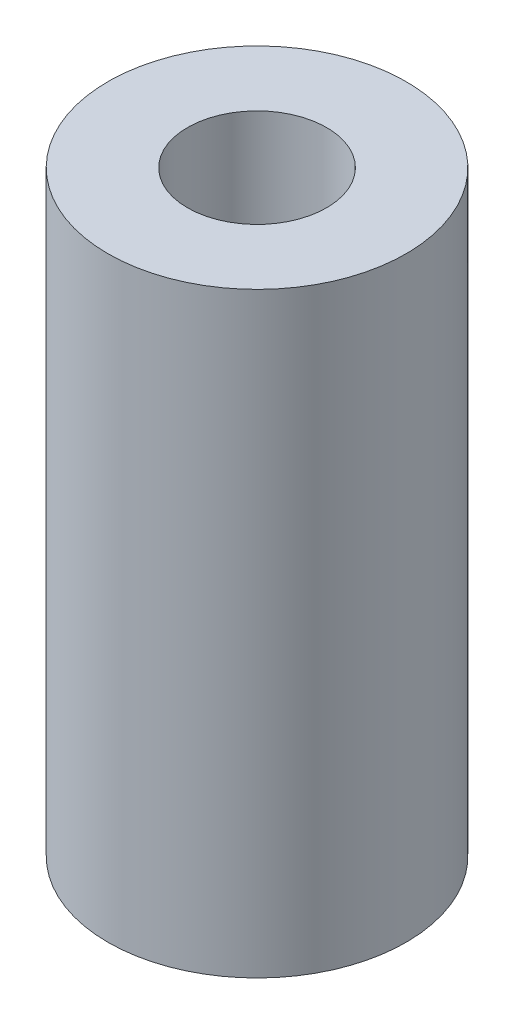
ISO-10303-21;
HEADER;
FILE_DESCRIPTION(('STEP AP214'),'2;1');
FILE_NAME('part.step','',(''),(''),'','','');
FILE_SCHEMA(('AUTOMOTIVE_DESIGN { 1 0 10303 214 1 1 1 1 }'));
ENDSEC;
DATA;
#1=APPLICATION_CONTEXT('core data for automotive mechanical design processes');
#2=APPLICATION_PROTOCOL_DEFINITION('international standard','automotive_design',2000,#1);
#3=PRODUCT_CONTEXT('',#1,'mechanical');
#4=PRODUCT('Part','Part','',(#3));
#5=PRODUCT_RELATED_PRODUCT_CATEGORY('part','',(#4));
#6=PRODUCT_DEFINITION_FORMATION('','',#4);
#7=PRODUCT_DEFINITION_CONTEXT('part definition',#1,'design');
#8=PRODUCT_DEFINITION('design','',#6,#7);
#9=PRODUCT_DEFINITION_SHAPE('','',#8);
#10=(LENGTH_UNIT() NAMED_UNIT(*) SI_UNIT(.MILLI.,.METRE.));
#11=(NAMED_UNIT(*) PLANE_ANGLE_UNIT() SI_UNIT($,.RADIAN.));
#12=(NAMED_UNIT(*) SI_UNIT($,.STERADIAN.) SOLID_ANGLE_UNIT());
#13=UNCERTAINTY_MEASURE_WITH_UNIT(LENGTH_MEASURE(1.E-05),#10,'distance_accuracy_value','');
#14=(GEOMETRIC_REPRESENTATION_CONTEXT(3) GLOBAL_UNCERTAINTY_ASSIGNED_CONTEXT((#13)) GLOBAL_UNIT_ASSIGNED_CONTEXT((#10,
#11,#12)) REPRESENTATION_CONTEXT('',''));
#15=CARTESIAN_POINT('',(0.,0.,0.));
#16=DIRECTION('',(0.,0.,1.));
#17=DIRECTION('',(1.,0.,0.));
#18=AXIS2_PLACEMENT_3D('',#15,#16,#17);
#19=CARTESIAN_POINT('',(0.,12.,0.));
#20=DIRECTION('',(0.,1.,0.));
#21=DIRECTION('',(0.,0.,1.));
#22=AXIS2_PLACEMENT_3D('',#19,#20,#21);
#23=PLANE('',#22);
#24=CARTESIAN_POINT('',(0.,12.,0.));
#25=DIRECTION('',(0.,1.,0.));
#26=DIRECTION('',(0.,0.,1.));
#27=AXIS2_PLACEMENT_3D('',#24,#25,#26);
#28=CIRCLE('',#27,3.);
#29=CARTESIAN_POINT('',(0.,12.,3.));
#30=VERTEX_POINT('',#29);
#31=EDGE_CURVE('E10',#30,#30,#28,.T.);
#32=ORIENTED_EDGE('',*,*,#31,.T.);
#33=EDGE_LOOP('',(#32));
#34=FACE_BOUND('',#33,.T.);
#35=CARTESIAN_POINT('',(0.,12.,0.));
#36=DIRECTION('',(0.,1.,0.));
#37=DIRECTION('',(0.,0.,1.));
#38=AXIS2_PLACEMENT_3D('',#35,#36,#37);
#39=CIRCLE('',#38,1.4);
#40=CARTESIAN_POINT('',(0.,12.,1.4));
#41=VERTEX_POINT('',#40);
#42=EDGE_CURVE('E42',#41,#41,#39,.T.);
#43=ORIENTED_EDGE('',*,*,#42,.F.);
#44=EDGE_LOOP('',(#43));
#45=FACE_BOUND('',#44,.T.);
#46=ADVANCED_FACE('F31',(#34,#45),#23,.T.);
#47=CARTESIAN_POINT('',(0.,0.,0.));
#48=DIRECTION('',(0.,1.,0.));
#49=DIRECTION('',(0.,0.,1.));
#50=AXIS2_PLACEMENT_3D('',#47,#48,#49);
#51=PLANE('',#50);
#52=CARTESIAN_POINT('',(0.,0.,0.));
#53=DIRECTION('',(0.,1.,0.));
#54=DIRECTION('',(0.,0.,1.));
#55=AXIS2_PLACEMENT_3D('',#52,#53,#54);
#56=CIRCLE('',#55,3.);
#57=CARTESIAN_POINT('',(0.,0.,3.));
#58=VERTEX_POINT('',#57);
#59=EDGE_CURVE('E35',#58,#58,#56,.T.);
#60=ORIENTED_EDGE('',*,*,#59,.F.);
#61=EDGE_LOOP('',(#60));
#62=FACE_BOUND('',#61,.T.);
#63=CARTESIAN_POINT('',(0.,0.,0.));
#64=DIRECTION('',(0.,1.,0.));
#65=DIRECTION('',(0.,0.,1.));
#66=AXIS2_PLACEMENT_3D('',#63,#64,#65);
#67=CIRCLE('',#66,1.4);
#68=CARTESIAN_POINT('',(0.,0.,1.4));
#69=VERTEX_POINT('',#68);
#70=EDGE_CURVE('E44',#69,#69,#67,.T.);
#71=ORIENTED_EDGE('',*,*,#70,.T.);
#72=EDGE_LOOP('',(#71));
#73=FACE_BOUND('',#72,.T.);
#74=ADVANCED_FACE('F54',(#62,#73),#51,.F.);
#75=CARTESIAN_POINT('',(0.,12.,0.));
#76=DIRECTION('',(0.,-1.,0.));
#77=DIRECTION('',(0.,0.,-1.));
#78=AXIS2_PLACEMENT_3D('',#75,#76,#77);
#79=CYLINDRICAL_SURFACE('',#78,3.);
#80=ORIENTED_EDGE('',*,*,#31,.F.);
#81=EDGE_LOOP('',(#80));
#82=FACE_BOUND('',#81,.T.);
#83=ORIENTED_EDGE('',*,*,#59,.T.);
#84=EDGE_LOOP('',(#83));
#85=FACE_BOUND('',#84,.T.);
#86=ADVANCED_FACE('F33',(#82,#85),#79,.T.);
#87=CARTESIAN_POINT('',(0.,12.,0.));
#88=DIRECTION('',(0.,-1.,0.));
#89=DIRECTION('',(0.,0.,-1.));
#90=AXIS2_PLACEMENT_3D('',#87,#88,#89);
#91=CYLINDRICAL_SURFACE('',#90,1.4);
#92=ORIENTED_EDGE('',*,*,#42,.T.);
#93=EDGE_LOOP('',(#92));
#94=FACE_BOUND('',#93,.T.);
#95=ORIENTED_EDGE('',*,*,#70,.F.);
#96=EDGE_LOOP('',(#95));
#97=FACE_BOUND('',#96,.T.);
#98=ADVANCED_FACE('F50',(#94,#97),#91,.F.);
#99=CLOSED_SHELL('',(#46,#74,#86,#98));
#100=MANIFOLD_SOLID_BREP('B2',#99);
#101=ADVANCED_BREP_SHAPE_REPRESENTATION('',(#18,#100),#14);
#102=SHAPE_DEFINITION_REPRESENTATION(#9,#101);
ENDSEC;
END-ISO-10303-21;
